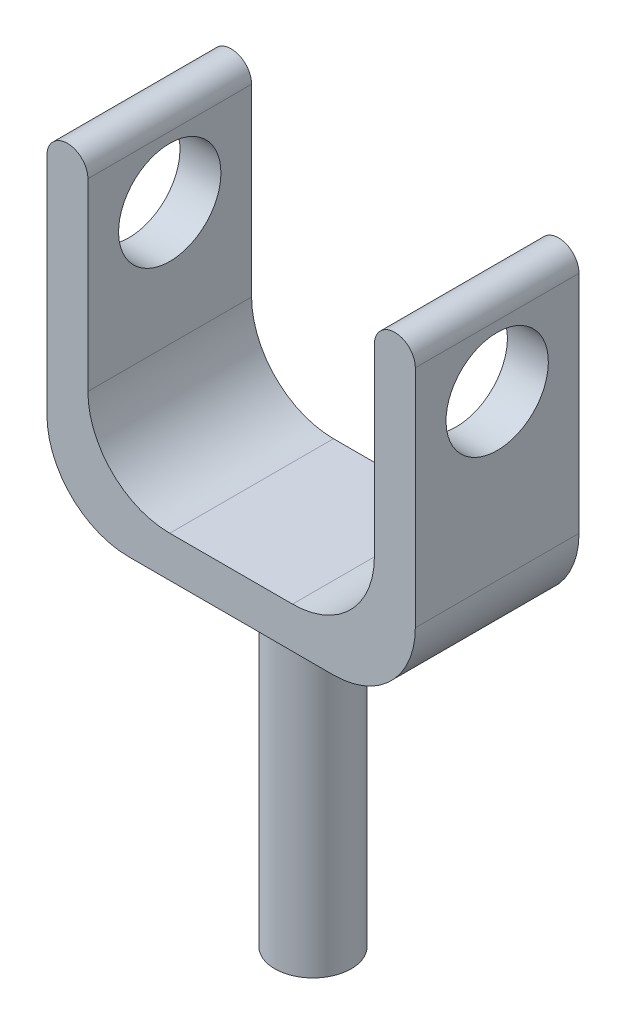
ISO-10303-21;
HEADER;
FILE_DESCRIPTION(('STEP AP214'),'2;1');
FILE_NAME('part.step','',(''),(''),'','','');
FILE_SCHEMA(('AUTOMOTIVE_DESIGN { 1 0 10303 214 1 1 1 1 }'));
ENDSEC;
DATA;
#1=APPLICATION_CONTEXT('core data for automotive mechanical design processes');
#2=APPLICATION_PROTOCOL_DEFINITION('international standard','automotive_design',2000,#1);
#3=PRODUCT_CONTEXT('',#1,'mechanical');
#4=PRODUCT('Part','Part','',(#3));
#5=PRODUCT_RELATED_PRODUCT_CATEGORY('part','',(#4));
#6=PRODUCT_DEFINITION_FORMATION('','',#4);
#7=PRODUCT_DEFINITION_CONTEXT('part definition',#1,'design');
#8=PRODUCT_DEFINITION('design','',#6,#7);
#9=PRODUCT_DEFINITION_SHAPE('','',#8);
#10=(LENGTH_UNIT() NAMED_UNIT(*) SI_UNIT(.MILLI.,.METRE.));
#11=(NAMED_UNIT(*) PLANE_ANGLE_UNIT() SI_UNIT($,.RADIAN.));
#12=(NAMED_UNIT(*) SI_UNIT($,.STERADIAN.) SOLID_ANGLE_UNIT());
#13=UNCERTAINTY_MEASURE_WITH_UNIT(LENGTH_MEASURE(1.E-05),#10,'distance_accuracy_value','');
#14=(GEOMETRIC_REPRESENTATION_CONTEXT(3) GLOBAL_UNCERTAINTY_ASSIGNED_CONTEXT((#13)) GLOBAL_UNIT_ASSIGNED_CONTEXT((#10,
#11,#12)) REPRESENTATION_CONTEXT('',''));
#15=CARTESIAN_POINT('',(0.,0.,0.));
#16=DIRECTION('',(0.,0.,1.));
#17=DIRECTION('',(1.,0.,0.));
#18=AXIS2_PLACEMENT_3D('',#15,#16,#17);
#19=CARTESIAN_POINT('',(-17.5,5.9702793047454,10.));
#20=DIRECTION('',(0.,-1.,0.));
#21=DIRECTION('',(0.,0.,-1.));
#22=AXIS2_PLACEMENT_3D('',#19,#20,#21);
#23=PLANE('',#22);
#24=DIRECTION('',(-1.,0.,0.));
#25=VECTOR('',#24,1.);
#26=CARTESIAN_POINT('',(-17.5,5.9702793047454,-10.));
#27=LINE('',#26,#25);
#28=CARTESIAN_POINT('',(7.50000000000001,5.9702793047454,-10.));
#29=VERTEX_POINT('',#28);
#30=CARTESIAN_POINT('',(-7.5,5.9702793047454,-10.));
#31=VERTEX_POINT('',#30);
#32=EDGE_CURVE('E185',#29,#31,#27,.T.);
#33=ORIENTED_EDGE('',*,*,#32,.T.);
#34=DIRECTION('',(0.,0.,-1.));
#35=VECTOR('',#34,1.);
#36=CARTESIAN_POINT('',(-7.5,5.9702793047454,10.));
#37=LINE('',#36,#35);
#38=CARTESIAN_POINT('',(-7.5,5.9702793047454,10.));
#39=VERTEX_POINT('',#38);
#40=EDGE_CURVE('E227',#31,#39,#37,.F.);
#41=ORIENTED_EDGE('',*,*,#40,.T.);
#42=DIRECTION('',(-1.,0.,0.));
#43=VECTOR('',#42,1.);
#44=CARTESIAN_POINT('',(-17.5,5.9702793047454,10.));
#45=LINE('',#44,#43);
#46=CARTESIAN_POINT('',(7.50000000000001,5.9702793047454,10.));
#47=VERTEX_POINT('',#46);
#48=EDGE_CURVE('E149',#47,#39,#45,.T.);
#49=ORIENTED_EDGE('',*,*,#48,.F.);
#50=DIRECTION('',(0.,0.,-1.));
#51=VECTOR('',#50,1.);
#52=CARTESIAN_POINT('',(7.50000000000001,5.9702793047454,-10.));
#53=LINE('',#52,#51);
#54=EDGE_CURVE('E223',#47,#29,#53,.T.);
#55=ORIENTED_EDGE('',*,*,#54,.T.);
#56=EDGE_LOOP('',(#33,#41,#49,#55));
#57=FACE_BOUND('',#56,.T.);
#58=ADVANCED_FACE('F43',(#57),#23,.F.);
#59=CARTESIAN_POINT('',(-17.5,5.9702793047454,10.));
#60=DIRECTION('',(-1.,0.,0.));
#61=DIRECTION('',(0.,0.,1.));
#62=AXIS2_PLACEMENT_3D('',#59,#60,#61);
#63=PLANE('',#62);
#64=CARTESIAN_POINT('',(-17.5,30.9702793047454,0.));
#65=DIRECTION('',(-1.,0.,0.));
#66=DIRECTION('',(0.,0.,1.));
#67=AXIS2_PLACEMENT_3D('',#64,#65,#66);
#68=CIRCLE('',#67,6.25);
#69=CARTESIAN_POINT('',(-17.5,37.2202793047454,0.));
#70=VERTEX_POINT('',#69);
#71=EDGE_CURVE('E289',#70,#70,#68,.T.);
#72=ORIENTED_EDGE('',*,*,#71,.T.);
#73=EDGE_LOOP('',(#72));
#74=FACE_BOUND('',#73,.T.);
#75=DIRECTION('',(0.,1.,0.));
#76=VECTOR('',#75,1.);
#77=CARTESIAN_POINT('',(-17.5,5.9702793047454,10.));
#78=LINE('',#77,#76);
#79=CARTESIAN_POINT('',(-17.5,15.9702793047454,10.));
#80=VERTEX_POINT('',#79);
#81=CARTESIAN_POINT('',(-17.5,38.4702793047454,10.));
#82=VERTEX_POINT('',#81);
#83=EDGE_CURVE('E136',#80,#82,#78,.T.);
#84=ORIENTED_EDGE('',*,*,#83,.F.);
#85=DIRECTION('',(0.,0.,-1.));
#86=VECTOR('',#85,1.);
#87=CARTESIAN_POINT('',(-17.5,15.9702793047454,-10.));
#88=LINE('',#87,#86);
#89=CARTESIAN_POINT('',(-17.5,15.9702793047454,-10.));
#90=VERTEX_POINT('',#89);
#91=EDGE_CURVE('E220',#80,#90,#88,.T.);
#92=ORIENTED_EDGE('',*,*,#91,.T.);
#93=DIRECTION('',(0.,1.,0.));
#94=VECTOR('',#93,1.);
#95=CARTESIAN_POINT('',(-17.5,5.9702793047454,-10.));
#96=LINE('',#95,#94);
#97=CARTESIAN_POINT('',(-17.5,38.4702793047454,-10.));
#98=VERTEX_POINT('',#97);
#99=EDGE_CURVE('E155',#90,#98,#96,.T.);
#100=ORIENTED_EDGE('',*,*,#99,.T.);
#101=DIRECTION('',(0.,0.,-1.));
#102=VECTOR('',#101,1.);
#103=CARTESIAN_POINT('',(-17.5,38.4702793047454,10.));
#104=LINE('',#103,#102);
#105=EDGE_CURVE('E152',#82,#98,#104,.T.);
#106=ORIENTED_EDGE('',*,*,#105,.F.);
#107=EDGE_LOOP('',(#84,#92,#100,#106));
#108=FACE_BOUND('',#107,.T.);
#109=ADVANCED_FACE('F153',(#74,#108),#63,.F.);
#110=CARTESIAN_POINT('',(-20.,38.4702793047454,10.));
#111=DIRECTION('',(0.,0.,-1.));
#112=DIRECTION('',(-1.,0.,0.));
#113=AXIS2_PLACEMENT_3D('',#110,#111,#112);
#114=CYLINDRICAL_SURFACE('',#113,2.5);
#115=CARTESIAN_POINT('',(-20.,38.4702793047454,-10.));
#116=DIRECTION('',(0.,0.,1.));
#117=DIRECTION('',(1.,0.,0.));
#118=AXIS2_PLACEMENT_3D('',#115,#116,#117);
#119=CIRCLE('',#118,2.5);
#120=CARTESIAN_POINT('',(-22.5,38.4702793047454,-10.));
#121=VERTEX_POINT('',#120);
#122=EDGE_CURVE('E192',#98,#121,#119,.T.);
#123=ORIENTED_EDGE('',*,*,#122,.T.);
#124=DIRECTION('',(0.,0.,-1.));
#125=VECTOR('',#124,1.);
#126=CARTESIAN_POINT('',(-22.5,38.4702793047454,10.));
#127=LINE('',#126,#125);
#128=CARTESIAN_POINT('',(-22.5,38.4702793047454,10.));
#129=VERTEX_POINT('',#128);
#130=EDGE_CURVE('E160',#129,#121,#127,.T.);
#131=ORIENTED_EDGE('',*,*,#130,.F.);
#132=CARTESIAN_POINT('',(-20.,38.4702793047454,10.));
#133=DIRECTION('',(0.,0.,1.));
#134=DIRECTION('',(1.,0.,0.));
#135=AXIS2_PLACEMENT_3D('',#132,#133,#134);
#136=CIRCLE('',#135,2.5);
#137=EDGE_CURVE('E140',#82,#129,#136,.T.);
#138=ORIENTED_EDGE('',*,*,#137,.F.);
#139=ORIENTED_EDGE('',*,*,#105,.T.);
#140=EDGE_LOOP('',(#123,#131,#138,#139));
#141=FACE_BOUND('',#140,.T.);
#142=ADVANCED_FACE('F162',(#141),#114,.T.);
#143=CARTESIAN_POINT('',(-22.5,0.970279304745398,10.));
#144=DIRECTION('',(1.,0.,0.));
#145=DIRECTION('',(0.,0.,-1.));
#146=AXIS2_PLACEMENT_3D('',#143,#144,#145);
#147=PLANE('',#146);
#148=CARTESIAN_POINT('',(-22.5,30.9702793047454,0.));
#149=DIRECTION('',(1.,0.,0.));
#150=DIRECTION('',(0.,1.,0.));
#151=AXIS2_PLACEMENT_3D('',#148,#149,#150);
#152=CIRCLE('',#151,6.25);
#153=CARTESIAN_POINT('',(-22.5,37.2202793047454,0.));
#154=VERTEX_POINT('',#153);
#155=EDGE_CURVE('E297',#154,#154,#152,.T.);
#156=ORIENTED_EDGE('',*,*,#155,.T.);
#157=EDGE_LOOP('',(#156));
#158=FACE_BOUND('',#157,.T.);
#159=DIRECTION('',(0.,-1.,0.));
#160=VECTOR('',#159,1.);
#161=CARTESIAN_POINT('',(-22.5,0.970279304745398,-10.));
#162=LINE('',#161,#160);
#163=CARTESIAN_POINT('',(-22.5,10.9702793047454,-10.));
#164=VERTEX_POINT('',#163);
#165=EDGE_CURVE('E195',#121,#164,#162,.T.);
#166=ORIENTED_EDGE('',*,*,#165,.T.);
#167=DIRECTION('',(0.,0.,-1.));
#168=VECTOR('',#167,1.);
#169=CARTESIAN_POINT('',(-22.5,10.9702793047454,10.));
#170=LINE('',#169,#168);
#171=CARTESIAN_POINT('',(-22.5,10.9702793047454,10.));
#172=VERTEX_POINT('',#171);
#173=EDGE_CURVE('E60',#164,#172,#170,.F.);
#174=ORIENTED_EDGE('',*,*,#173,.T.);
#175=DIRECTION('',(0.,-1.,0.));
#176=VECTOR('',#175,1.);
#177=CARTESIAN_POINT('',(-22.5,0.970279304745398,10.));
#178=LINE('',#177,#176);
#179=EDGE_CURVE('E165',#129,#172,#178,.T.);
#180=ORIENTED_EDGE('',*,*,#179,.F.);
#181=ORIENTED_EDGE('',*,*,#130,.T.);
#182=EDGE_LOOP('',(#166,#174,#180,#181));
#183=FACE_BOUND('',#182,.T.);
#184=ADVANCED_FACE('F332',(#158,#183),#147,.F.);
#185=CARTESIAN_POINT('',(-22.5,0.970279304745398,10.));
#186=DIRECTION('',(0.,1.,0.));
#187=DIRECTION('',(0.,0.,1.));
#188=AXIS2_PLACEMENT_3D('',#185,#186,#187);
#189=PLANE('',#188);
#190=CARTESIAN_POINT('',(0.,0.970279304745398,0.));
#191=DIRECTION('',(0.,-1.,0.));
#192=DIRECTION('',(0.,0.,-1.));
#193=AXIS2_PLACEMENT_3D('',#190,#191,#192);
#194=CIRCLE('',#193,4.67425);
#195=CARTESIAN_POINT('',(0.,0.970279304745398,-4.67425));
#196=VERTEX_POINT('',#195);
#197=EDGE_CURVE('E159',#196,#196,#194,.T.);
#198=ORIENTED_EDGE('',*,*,#197,.F.);
#199=EDGE_LOOP('',(#198));
#200=FACE_BOUND('',#199,.T.);
#201=DIRECTION('',(1.,0.,0.));
#202=VECTOR('',#201,1.);
#203=CARTESIAN_POINT('',(-22.5,0.970279304745398,-10.));
#204=LINE('',#203,#202);
#205=CARTESIAN_POINT('',(-12.5,0.970279304745398,-10.));
#206=VERTEX_POINT('',#205);
#207=CARTESIAN_POINT('',(12.5,0.970279304745398,-10.));
#208=VERTEX_POINT('',#207);
#209=EDGE_CURVE('E198',#206,#208,#204,.T.);
#210=ORIENTED_EDGE('',*,*,#209,.T.);
#211=DIRECTION('',(0.,0.,-1.));
#212=VECTOR('',#211,1.);
#213=CARTESIAN_POINT('',(12.5,0.970279304745398,10.));
#214=LINE('',#213,#212);
#215=CARTESIAN_POINT('',(12.5,0.970279304745398,10.));
#216=VERTEX_POINT('',#215);
#217=EDGE_CURVE('E68',#208,#216,#214,.F.);
#218=ORIENTED_EDGE('',*,*,#217,.T.);
#219=DIRECTION('',(1.,0.,0.));
#220=VECTOR('',#219,1.);
#221=CARTESIAN_POINT('',(-22.5,0.970279304745398,10.));
#222=LINE('',#221,#220);
#223=CARTESIAN_POINT('',(-12.5,0.970279304745398,10.));
#224=VERTEX_POINT('',#223);
#225=EDGE_CURVE('E168',#224,#216,#222,.T.);
#226=ORIENTED_EDGE('',*,*,#225,.F.);
#227=DIRECTION('',(0.,0.,-1.));
#228=VECTOR('',#227,1.);
#229=CARTESIAN_POINT('',(-12.5,0.970279304745398,10.));
#230=LINE('',#229,#228);
#231=EDGE_CURVE('E243',#224,#206,#230,.T.);
#232=ORIENTED_EDGE('',*,*,#231,.T.);
#233=EDGE_LOOP('',(#210,#218,#226,#232));
#234=FACE_BOUND('',#233,.T.);
#235=ADVANCED_FACE('F318',(#200,#234),#189,.F.);
#236=CARTESIAN_POINT('',(22.5,0.970279304745398,10.));
#237=DIRECTION('',(-1.,0.,0.));
#238=DIRECTION('',(0.,-1.,0.));
#239=AXIS2_PLACEMENT_3D('',#236,#237,#238);
#240=PLANE('',#239);
#241=CARTESIAN_POINT('',(22.5,30.9702793047454,0.));
#242=DIRECTION('',(-1.,0.,0.));
#243=DIRECTION('',(0.,-1.,0.));
#244=AXIS2_PLACEMENT_3D('',#241,#242,#243);
#245=CIRCLE('',#244,6.25);
#246=CARTESIAN_POINT('',(22.5,37.2202793047454,0.));
#247=VERTEX_POINT('',#246);
#248=EDGE_CURVE('E293',#247,#247,#245,.T.);
#249=ORIENTED_EDGE('',*,*,#248,.T.);
#250=EDGE_LOOP('',(#249));
#251=FACE_BOUND('',#250,.T.);
#252=DIRECTION('',(0.,1.,0.));
#253=VECTOR('',#252,1.);
#254=CARTESIAN_POINT('',(22.5,0.970279304745398,10.));
#255=LINE('',#254,#253);
#256=CARTESIAN_POINT('',(22.5,10.9702793047454,10.));
#257=VERTEX_POINT('',#256);
#258=CARTESIAN_POINT('',(22.5,38.4702793047454,10.));
#259=VERTEX_POINT('',#258);
#260=EDGE_CURVE('E174',#257,#259,#255,.T.);
#261=ORIENTED_EDGE('',*,*,#260,.F.);
#262=DIRECTION('',(0.,0.,-1.));
#263=VECTOR('',#262,1.);
#264=CARTESIAN_POINT('',(22.5,10.9702793047454,10.));
#265=LINE('',#264,#263);
#266=CARTESIAN_POINT('',(22.5,10.9702793047454,-10.));
#267=VERTEX_POINT('',#266);
#268=EDGE_CURVE('E233',#257,#267,#265,.T.);
#269=ORIENTED_EDGE('',*,*,#268,.T.);
#270=DIRECTION('',(0.,1.,0.));
#271=VECTOR('',#270,1.);
#272=CARTESIAN_POINT('',(22.5,0.970279304745398,-10.));
#273=LINE('',#272,#271);
#274=CARTESIAN_POINT('',(22.5,38.4702793047454,-10.));
#275=VERTEX_POINT('',#274);
#276=EDGE_CURVE('E201',#267,#275,#273,.T.);
#277=ORIENTED_EDGE('',*,*,#276,.T.);
#278=DIRECTION('',(0.,0.,-1.));
#279=VECTOR('',#278,1.);
#280=CARTESIAN_POINT('',(22.5,38.4702793047454,10.));
#281=LINE('',#280,#279);
#282=EDGE_CURVE('E214',#259,#275,#281,.T.);
#283=ORIENTED_EDGE('',*,*,#282,.F.);
#284=EDGE_LOOP('',(#261,#269,#277,#283));
#285=FACE_BOUND('',#284,.T.);
#286=ADVANCED_FACE('F314',(#251,#285),#240,.F.);
#287=CARTESIAN_POINT('',(20.,38.4702793047454,10.));
#288=DIRECTION('',(0.,0.,-1.));
#289=DIRECTION('',(-1.,0.,0.));
#290=AXIS2_PLACEMENT_3D('',#287,#288,#289);
#291=CYLINDRICAL_SURFACE('',#290,2.5);
#292=CARTESIAN_POINT('',(20.,38.4702793047454,-10.));
#293=DIRECTION('',(0.,0.,1.));
#294=DIRECTION('',(-1.,0.,0.));
#295=AXIS2_PLACEMENT_3D('',#292,#293,#294);
#296=CIRCLE('',#295,2.5);
#297=CARTESIAN_POINT('',(17.5,38.4702793047454,-10.));
#298=VERTEX_POINT('',#297);
#299=EDGE_CURVE('E204',#275,#298,#296,.T.);
#300=ORIENTED_EDGE('',*,*,#299,.T.);
#301=DIRECTION('',(0.,0.,-1.));
#302=VECTOR('',#301,1.);
#303=CARTESIAN_POINT('',(17.5,38.4702793047454,10.));
#304=LINE('',#303,#302);
#305=CARTESIAN_POINT('',(17.5,38.4702793047454,10.));
#306=VERTEX_POINT('',#305);
#307=EDGE_CURVE('E184',#306,#298,#304,.T.);
#308=ORIENTED_EDGE('',*,*,#307,.F.);
#309=CARTESIAN_POINT('',(20.,38.4702793047454,10.));
#310=DIRECTION('',(0.,0.,1.));
#311=DIRECTION('',(-1.,0.,0.));
#312=AXIS2_PLACEMENT_3D('',#309,#310,#311);
#313=CIRCLE('',#312,2.5);
#314=EDGE_CURVE('E177',#259,#306,#313,.T.);
#315=ORIENTED_EDGE('',*,*,#314,.F.);
#316=ORIENTED_EDGE('',*,*,#282,.T.);
#317=EDGE_LOOP('',(#300,#308,#315,#316));
#318=FACE_BOUND('',#317,.T.);
#319=ADVANCED_FACE('F317',(#318),#291,.T.);
#320=CARTESIAN_POINT('',(17.5,5.9702793047454,10.));
#321=DIRECTION('',(1.,0.,0.));
#322=DIRECTION('',(0.,1.,0.));
#323=AXIS2_PLACEMENT_3D('',#320,#321,#322);
#324=PLANE('',#323);
#325=CARTESIAN_POINT('',(17.5,30.9702793047454,0.));
#326=DIRECTION('',(1.,0.,0.));
#327=DIRECTION('',(0.,1.,0.));
#328=AXIS2_PLACEMENT_3D('',#325,#326,#327);
#329=CIRCLE('',#328,6.25);
#330=CARTESIAN_POINT('',(17.5,37.2202793047454,0.));
#331=VERTEX_POINT('',#330);
#332=EDGE_CURVE('E47',#331,#331,#329,.T.);
#333=ORIENTED_EDGE('',*,*,#332,.T.);
#334=EDGE_LOOP('',(#333));
#335=FACE_BOUND('',#334,.T.);
#336=DIRECTION('',(0.,-1.,0.));
#337=VECTOR('',#336,1.);
#338=CARTESIAN_POINT('',(17.5,5.9702793047454,-10.));
#339=LINE('',#338,#337);
#340=CARTESIAN_POINT('',(17.5,15.9702793047454,-10.));
#341=VERTEX_POINT('',#340);
#342=EDGE_CURVE('E207',#298,#341,#339,.T.);
#343=ORIENTED_EDGE('',*,*,#342,.T.);
#344=DIRECTION('',(0.,0.,-1.));
#345=VECTOR('',#344,1.);
#346=CARTESIAN_POINT('',(17.5,15.9702793047454,10.));
#347=LINE('',#346,#345);
#348=CARTESIAN_POINT('',(17.5,15.9702793047454,10.));
#349=VERTEX_POINT('',#348);
#350=EDGE_CURVE('E230',#341,#349,#347,.F.);
#351=ORIENTED_EDGE('',*,*,#350,.T.);
#352=DIRECTION('',(0.,-1.,0.));
#353=VECTOR('',#352,1.);
#354=CARTESIAN_POINT('',(17.5,5.9702793047454,10.));
#355=LINE('',#354,#353);
#356=EDGE_CURVE('E180',#306,#349,#355,.T.);
#357=ORIENTED_EDGE('',*,*,#356,.F.);
#358=ORIENTED_EDGE('',*,*,#307,.T.);
#359=EDGE_LOOP('',(#343,#351,#357,#358));
#360=FACE_BOUND('',#359,.T.);
#361=ADVANCED_FACE('F273',(#335,#360),#324,.F.);
#362=CARTESIAN_POINT('',(20.,38.4702793047454,10.));
#363=DIRECTION('',(0.,0.,-1.));
#364=DIRECTION('',(-1.,0.,0.));
#365=AXIS2_PLACEMENT_3D('',#362,#363,#364);
#366=PLANE('',#365);
#367=ORIENTED_EDGE('',*,*,#225,.T.);
#368=CARTESIAN_POINT('',(12.5,10.9702793047454,10.));
#369=DIRECTION('',(0.,0.,-1.));
#370=DIRECTION('',(-1.,0.,0.));
#371=AXIS2_PLACEMENT_3D('',#368,#369,#370);
#372=CIRCLE('',#371,10.);
#373=EDGE_CURVE('E252',#216,#257,#372,.F.);
#374=ORIENTED_EDGE('',*,*,#373,.T.);
#375=ORIENTED_EDGE('',*,*,#260,.T.);
#376=ORIENTED_EDGE('',*,*,#314,.T.);
#377=ORIENTED_EDGE('',*,*,#356,.T.);
#378=CARTESIAN_POINT('',(7.50000000000001,15.9702793047454,10.));
#379=DIRECTION('',(0.,0.,-1.));
#380=DIRECTION('',(-1.,0.,0.));
#381=AXIS2_PLACEMENT_3D('',#378,#379,#380);
#382=CIRCLE('',#381,10.);
#383=EDGE_CURVE('E11',#349,#47,#382,.T.);
#384=ORIENTED_EDGE('',*,*,#383,.T.);
#385=ORIENTED_EDGE('',*,*,#48,.T.);
#386=CARTESIAN_POINT('',(-7.5,15.9702793047454,10.));
#387=DIRECTION('',(0.,0.,-1.));
#388=DIRECTION('',(-1.,0.,0.));
#389=AXIS2_PLACEMENT_3D('',#386,#387,#388);
#390=CIRCLE('',#389,10.);
#391=EDGE_CURVE('E144',#39,#80,#390,.T.);
#392=ORIENTED_EDGE('',*,*,#391,.T.);
#393=ORIENTED_EDGE('',*,*,#83,.T.);
#394=ORIENTED_EDGE('',*,*,#137,.T.);
#395=ORIENTED_EDGE('',*,*,#179,.T.);
#396=CARTESIAN_POINT('',(-12.5,10.9702793047454,10.));
#397=DIRECTION('',(0.,0.,-1.));
#398=DIRECTION('',(-1.,0.,0.));
#399=AXIS2_PLACEMENT_3D('',#396,#397,#398);
#400=CIRCLE('',#399,10.);
#401=EDGE_CURVE('E249',#172,#224,#400,.F.);
#402=ORIENTED_EDGE('',*,*,#401,.T.);
#403=EDGE_LOOP('',(#367,#374,#375,#376,#377,#384,#385,#392,#393,#394,#395,#402));
#404=FACE_BOUND('',#403,.T.);
#405=ADVANCED_FACE('F138',(#404),#366,.F.);
#406=CARTESIAN_POINT('',(20.,38.4702793047454,-10.));
#407=DIRECTION('',(0.,0.,-1.));
#408=DIRECTION('',(-1.,0.,0.));
#409=AXIS2_PLACEMENT_3D('',#406,#407,#408);
#410=PLANE('',#409);
#411=ORIENTED_EDGE('',*,*,#276,.F.);
#412=CARTESIAN_POINT('',(12.5,10.9702793047454,-10.));
#413=DIRECTION('',(0.,0.,-1.));
#414=DIRECTION('',(-1.,0.,0.));
#415=AXIS2_PLACEMENT_3D('',#412,#413,#414);
#416=CIRCLE('',#415,10.);
#417=EDGE_CURVE('E240',#267,#208,#416,.T.);
#418=ORIENTED_EDGE('',*,*,#417,.T.);
#419=ORIENTED_EDGE('',*,*,#209,.F.);
#420=CARTESIAN_POINT('',(-12.5,10.9702793047454,-10.));
#421=DIRECTION('',(0.,0.,-1.));
#422=DIRECTION('',(-1.,0.,0.));
#423=AXIS2_PLACEMENT_3D('',#420,#421,#422);
#424=CIRCLE('',#423,10.);
#425=EDGE_CURVE('E237',#206,#164,#424,.T.);
#426=ORIENTED_EDGE('',*,*,#425,.T.);
#427=ORIENTED_EDGE('',*,*,#165,.F.);
#428=ORIENTED_EDGE('',*,*,#122,.F.);
#429=ORIENTED_EDGE('',*,*,#99,.F.);
#430=CARTESIAN_POINT('',(-7.5,15.9702793047454,-10.));
#431=DIRECTION('',(0.,0.,-1.));
#432=DIRECTION('',(-1.,0.,0.));
#433=AXIS2_PLACEMENT_3D('',#430,#431,#432);
#434=CIRCLE('',#433,10.);
#435=EDGE_CURVE('E257',#90,#31,#434,.F.);
#436=ORIENTED_EDGE('',*,*,#435,.T.);
#437=ORIENTED_EDGE('',*,*,#32,.F.);
#438=CARTESIAN_POINT('',(7.50000000000001,15.9702793047454,-10.));
#439=DIRECTION('',(0.,0.,-1.));
#440=DIRECTION('',(-1.,0.,0.));
#441=AXIS2_PLACEMENT_3D('',#438,#439,#440);
#442=CIRCLE('',#441,10.);
#443=EDGE_CURVE('E53',#29,#341,#442,.F.);
#444=ORIENTED_EDGE('',*,*,#443,.T.);
#445=ORIENTED_EDGE('',*,*,#342,.F.);
#446=ORIENTED_EDGE('',*,*,#299,.F.);
#447=EDGE_LOOP('',(#411,#418,#419,#426,#427,#428,#429,#436,#437,#444,#445,#446));
#448=FACE_BOUND('',#447,.T.);
#449=ADVANCED_FACE('F267',(#448),#410,.T.);
#450=CARTESIAN_POINT('',(0.,-39.0297206952546,0.));
#451=DIRECTION('',(0.,1.,0.));
#452=DIRECTION('',(0.,0.,1.));
#453=AXIS2_PLACEMENT_3D('',#450,#451,#452);
#454=CYLINDRICAL_SURFACE('',#453,4.67425);
#455=CARTESIAN_POINT('',(0.,-39.0297206952546,0.));
#456=DIRECTION('',(0.,-1.,0.));
#457=DIRECTION('',(0.,0.,-1.));
#458=AXIS2_PLACEMENT_3D('',#455,#456,#457);
#459=CIRCLE('',#458,4.67425);
#460=CARTESIAN_POINT('',(0.,-39.0297206952546,-4.67425));
#461=VERTEX_POINT('',#460);
#462=EDGE_CURVE('E189',#461,#461,#459,.T.);
#463=ORIENTED_EDGE('',*,*,#462,.F.);
#464=EDGE_LOOP('',(#463));
#465=FACE_BOUND('',#464,.T.);
#466=ORIENTED_EDGE('',*,*,#197,.T.);
#467=EDGE_LOOP('',(#466));
#468=FACE_BOUND('',#467,.T.);
#469=ADVANCED_FACE('F400',(#465,#468),#454,.T.);
#470=CARTESIAN_POINT('',(0.,-39.0297206952546,0.));
#471=DIRECTION('',(0.,-1.,0.));
#472=DIRECTION('',(0.,0.,-1.));
#473=AXIS2_PLACEMENT_3D('',#470,#471,#472);
#474=PLANE('',#473);
#475=ORIENTED_EDGE('',*,*,#462,.T.);
#476=EDGE_LOOP('',(#475));
#477=FACE_BOUND('',#476,.T.);
#478=ADVANCED_FACE('F353',(#477),#474,.T.);
#479=CARTESIAN_POINT('',(-7.5,15.9702793047454,10.));
#480=DIRECTION('',(0.,0.,1.));
#481=DIRECTION('',(1.,0.,0.));
#482=AXIS2_PLACEMENT_3D('',#479,#480,#481);
#483=CYLINDRICAL_SURFACE('',#482,10.);
#484=ORIENTED_EDGE('',*,*,#391,.F.);
#485=ORIENTED_EDGE('',*,*,#40,.F.);
#486=ORIENTED_EDGE('',*,*,#435,.F.);
#487=ORIENTED_EDGE('',*,*,#91,.F.);
#488=EDGE_LOOP('',(#484,#485,#486,#487));
#489=FACE_BOUND('',#488,.T.);
#490=ADVANCED_FACE('F350',(#489),#483,.F.);
#491=CARTESIAN_POINT('',(7.50000000000001,15.9702793047454,10.));
#492=DIRECTION('',(0.,0.,1.));
#493=DIRECTION('',(1.,0.,0.));
#494=AXIS2_PLACEMENT_3D('',#491,#492,#493);
#495=CYLINDRICAL_SURFACE('',#494,10.);
#496=ORIENTED_EDGE('',*,*,#383,.F.);
#497=ORIENTED_EDGE('',*,*,#350,.F.);
#498=ORIENTED_EDGE('',*,*,#443,.F.);
#499=ORIENTED_EDGE('',*,*,#54,.F.);
#500=EDGE_LOOP('',(#496,#497,#498,#499));
#501=FACE_BOUND('',#500,.T.);
#502=ADVANCED_FACE('F277',(#501),#495,.F.);
#503=CARTESIAN_POINT('',(12.5,10.9702793047454,10.));
#504=DIRECTION('',(0.,0.,-1.));
#505=DIRECTION('',(-1.,0.,0.));
#506=AXIS2_PLACEMENT_3D('',#503,#504,#505);
#507=CYLINDRICAL_SURFACE('',#506,10.);
#508=ORIENTED_EDGE('',*,*,#373,.F.);
#509=ORIENTED_EDGE('',*,*,#217,.F.);
#510=ORIENTED_EDGE('',*,*,#417,.F.);
#511=ORIENTED_EDGE('',*,*,#268,.F.);
#512=EDGE_LOOP('',(#508,#509,#510,#511));
#513=FACE_BOUND('',#512,.T.);
#514=ADVANCED_FACE('F326',(#513),#507,.T.);
#515=CARTESIAN_POINT('',(-12.5,10.9702793047454,10.));
#516=DIRECTION('',(0.,0.,-1.));
#517=DIRECTION('',(-1.,0.,0.));
#518=AXIS2_PLACEMENT_3D('',#515,#516,#517);
#519=CYLINDRICAL_SURFACE('',#518,10.);
#520=ORIENTED_EDGE('',*,*,#401,.F.);
#521=ORIENTED_EDGE('',*,*,#173,.F.);
#522=ORIENTED_EDGE('',*,*,#425,.F.);
#523=ORIENTED_EDGE('',*,*,#231,.F.);
#524=EDGE_LOOP('',(#520,#521,#522,#523));
#525=FACE_BOUND('',#524,.T.);
#526=ADVANCED_FACE('F45',(#525),#519,.T.);
#527=CARTESIAN_POINT('',(-22.5,30.9702793047454,0.));
#528=DIRECTION('',(1.,0.,0.));
#529=DIRECTION('',(0.,1.,0.));
#530=AXIS2_PLACEMENT_3D('',#527,#528,#529);
#531=CYLINDRICAL_SURFACE('',#530,6.25);
#532=CARTESIAN_POINT('',(17.5,37.2202793047454,0.));
#533=CARTESIAN_POINT('',(17.5520833333333,37.2202793047454,0.));
#534=CARTESIAN_POINT('',(17.6041666666667,37.2202793047454,0.));
#535=CARTESIAN_POINT('',(17.7083333333333,37.2202793047454,0.));
#536=CARTESIAN_POINT('',(17.7604166666667,37.2202793047454,0.));
#537=CARTESIAN_POINT('',(17.8645833333333,37.2202793047454,0.));
#538=CARTESIAN_POINT('',(17.9166666666667,37.2202793047454,0.));
#539=CARTESIAN_POINT('',(18.0208333333333,37.2202793047454,0.));
#540=CARTESIAN_POINT('',(18.0729166666667,37.2202793047454,0.));
#541=CARTESIAN_POINT('',(18.1770833333333,37.2202793047454,0.));
#542=CARTESIAN_POINT('',(18.2291666666667,37.2202793047454,0.));
#543=CARTESIAN_POINT('',(18.3333333333333,37.2202793047454,0.));
#544=CARTESIAN_POINT('',(18.3854166666667,37.2202793047454,0.));
#545=CARTESIAN_POINT('',(18.4895833333333,37.2202793047454,0.));
#546=CARTESIAN_POINT('',(18.5416666666667,37.2202793047454,0.));
#547=CARTESIAN_POINT('',(18.6458333333333,37.2202793047454,0.));
#548=CARTESIAN_POINT('',(18.6979166666667,37.2202793047454,0.));
#549=CARTESIAN_POINT('',(18.8020833333333,37.2202793047454,0.));
#550=CARTESIAN_POINT('',(18.8541666666667,37.2202793047454,0.));
#551=CARTESIAN_POINT('',(18.9583333333333,37.2202793047454,0.));
#552=CARTESIAN_POINT('',(19.0104166666667,37.2202793047454,0.));
#553=CARTESIAN_POINT('',(19.1145833333333,37.2202793047454,0.));
#554=CARTESIAN_POINT('',(19.1666666666667,37.2202793047454,0.));
#555=CARTESIAN_POINT('',(19.2708333333333,37.2202793047454,0.));
#556=CARTESIAN_POINT('',(19.3229166666667,37.2202793047454,0.));
#557=CARTESIAN_POINT('',(19.4270833333333,37.2202793047454,0.));
#558=CARTESIAN_POINT('',(19.4791666666667,37.2202793047454,0.));
#559=CARTESIAN_POINT('',(19.5833333333333,37.2202793047454,0.));
#560=CARTESIAN_POINT('',(19.6354166666667,37.2202793047454,0.));
#561=CARTESIAN_POINT('',(19.7395833333333,37.2202793047454,0.));
#562=CARTESIAN_POINT('',(19.7916666666667,37.2202793047454,0.));
#563=CARTESIAN_POINT('',(19.8958333333333,37.2202793047454,0.));
#564=CARTESIAN_POINT('',(19.9479166666667,37.2202793047454,0.));
#565=CARTESIAN_POINT('',(20.0520833333333,37.2202793047454,0.));
#566=CARTESIAN_POINT('',(20.1041666666667,37.2202793047454,0.));
#567=CARTESIAN_POINT('',(20.2083333333333,37.2202793047454,0.));
#568=CARTESIAN_POINT('',(20.2604166666667,37.2202793047454,0.));
#569=CARTESIAN_POINT('',(20.3645833333333,37.2202793047454,0.));
#570=CARTESIAN_POINT('',(20.4166666666667,37.2202793047454,0.));
#571=CARTESIAN_POINT('',(20.5208333333333,37.2202793047454,0.));
#572=CARTESIAN_POINT('',(20.5729166666667,37.2202793047454,0.));
#573=CARTESIAN_POINT('',(20.6770833333333,37.2202793047454,0.));
#574=CARTESIAN_POINT('',(20.7291666666667,37.2202793047454,0.));
#575=CARTESIAN_POINT('',(20.8333333333333,37.2202793047454,0.));
#576=CARTESIAN_POINT('',(20.8854166666667,37.2202793047454,0.));
#577=CARTESIAN_POINT('',(20.9895833333333,37.2202793047454,0.));
#578=CARTESIAN_POINT('',(21.0416666666667,37.2202793047454,0.));
#579=CARTESIAN_POINT('',(21.1458333333333,37.2202793047454,0.));
#580=CARTESIAN_POINT('',(21.1979166666667,37.2202793047454,0.));
#581=CARTESIAN_POINT('',(21.3020833333333,37.2202793047454,0.));
#582=CARTESIAN_POINT('',(21.3541666666667,37.2202793047454,0.));
#583=CARTESIAN_POINT('',(21.4583333333333,37.2202793047454,0.));
#584=CARTESIAN_POINT('',(21.5104166666667,37.2202793047454,0.));
#585=CARTESIAN_POINT('',(21.6145833333333,37.2202793047454,0.));
#586=CARTESIAN_POINT('',(21.6666666666667,37.2202793047454,0.));
#587=CARTESIAN_POINT('',(21.7708333333333,37.2202793047454,0.));
#588=CARTESIAN_POINT('',(21.8229166666667,37.2202793047454,0.));
#589=CARTESIAN_POINT('',(21.9270833333333,37.2202793047454,0.));
#590=CARTESIAN_POINT('',(21.9791666666667,37.2202793047454,0.));
#591=CARTESIAN_POINT('',(22.0833333333333,37.2202793047454,0.));
#592=CARTESIAN_POINT('',(22.1354166666667,37.2202793047454,0.));
#593=CARTESIAN_POINT('',(22.2395833333333,37.2202793047454,0.));
#594=CARTESIAN_POINT('',(22.2916666666667,37.2202793047454,0.));
#595=CARTESIAN_POINT('',(22.3958333333333,37.2202793047454,0.));
#596=CARTESIAN_POINT('',(22.4479166666667,37.2202793047454,0.));
#597=CARTESIAN_POINT('',(22.5,37.2202793047454,0.));
#598=B_SPLINE_CURVE_WITH_KNOTS('',3,(#532,#533,#534,#535,#536,#537,#538,#539,#540,#541,#542,
#543,#544,#545,#546,#547,#548,#549,#550,#551,#552,#553,#554,#555,#556,#557,#558,#559,#560,#561,
#562,#563,#564,#565,#566,#567,#568,#569,#570,#571,#572,#573,#574,#575,#576,#577,#578,#579,#580,
#581,#582,#583,#584,#585,#586,#587,#588,#589,#590,#591,#592,#593,#594,#595,#596,#597),
.UNSPECIFIED.,.F.,.F.,(4,2,2,2,2,2,2,2,2,2,2,2,2,2,2,2,2,2,2,2,2,2,2,2,2,2,2,2,2,2,2,2,4),(0.,
0.156249999999997,0.3125,0.468750000000004,0.625000000000001,0.781249999999997,
0.937500000000001,1.09375,1.25,1.40625,1.5625,1.71875,1.875,2.03125,2.1875,2.34375000000001,2.5,
2.65625,2.8125,2.96875000000001,3.125,3.28125,3.4375,3.59375000000001,3.75,3.90625,4.0625,
4.21875000000001,4.375,4.53125,4.6875,4.84375000000001,5.),.UNSPECIFIED.);
#599=EDGE_CURVE('BSEAM307',#331,#247,#598,.T.);
#600=ORIENTED_EDGE('',*,*,#332,.F.);
#601=ORIENTED_EDGE('',*,*,#248,.F.);
#602=ORIENTED_EDGE('',*,*,#599,.T.);
#603=ORIENTED_EDGE('',*,*,#599,.F.);
#604=EDGE_LOOP('',(#600,#602,#601,#603));
#605=FACE_BOUND('',#604,.T.);
#606=ADVANCED_FACE('F307',(#605),#531,.F.);
#607=CARTESIAN_POINT('',(-22.5,37.2202793047454,0.));
#608=CARTESIAN_POINT('',(-22.4479166666667,37.2202793047454,0.));
#609=CARTESIAN_POINT('',(-22.3958333333333,37.2202793047454,0.));
#610=CARTESIAN_POINT('',(-22.2916666666667,37.2202793047454,0.));
#611=CARTESIAN_POINT('',(-22.2395833333333,37.2202793047454,0.));
#612=CARTESIAN_POINT('',(-22.1354166666667,37.2202793047454,0.));
#613=CARTESIAN_POINT('',(-22.0833333333333,37.2202793047454,0.));
#614=CARTESIAN_POINT('',(-21.9791666666667,37.2202793047454,0.));
#615=CARTESIAN_POINT('',(-21.9270833333333,37.2202793047454,0.));
#616=CARTESIAN_POINT('',(-21.8229166666667,37.2202793047454,0.));
#617=CARTESIAN_POINT('',(-21.7708333333333,37.2202793047454,0.));
#618=CARTESIAN_POINT('',(-21.6666666666667,37.2202793047454,0.));
#619=CARTESIAN_POINT('',(-21.6145833333333,37.2202793047454,0.));
#620=CARTESIAN_POINT('',(-21.5104166666667,37.2202793047454,0.));
#621=CARTESIAN_POINT('',(-21.4583333333333,37.2202793047454,0.));
#622=CARTESIAN_POINT('',(-21.3541666666667,37.2202793047454,0.));
#623=CARTESIAN_POINT('',(-21.3020833333333,37.2202793047454,0.));
#624=CARTESIAN_POINT('',(-21.1979166666667,37.2202793047454,0.));
#625=CARTESIAN_POINT('',(-21.1458333333333,37.2202793047454,0.));
#626=CARTESIAN_POINT('',(-21.0416666666667,37.2202793047454,0.));
#627=CARTESIAN_POINT('',(-20.9895833333333,37.2202793047454,0.));
#628=CARTESIAN_POINT('',(-20.8854166666667,37.2202793047454,0.));
#629=CARTESIAN_POINT('',(-20.8333333333333,37.2202793047454,0.));
#630=CARTESIAN_POINT('',(-20.7291666666667,37.2202793047454,0.));
#631=CARTESIAN_POINT('',(-20.6770833333333,37.2202793047454,0.));
#632=CARTESIAN_POINT('',(-20.5729166666667,37.2202793047454,0.));
#633=CARTESIAN_POINT('',(-20.5208333333333,37.2202793047454,0.));
#634=CARTESIAN_POINT('',(-20.4166666666667,37.2202793047454,0.));
#635=CARTESIAN_POINT('',(-20.3645833333333,37.2202793047454,0.));
#636=CARTESIAN_POINT('',(-20.2604166666667,37.2202793047454,0.));
#637=CARTESIAN_POINT('',(-20.2083333333333,37.2202793047454,0.));
#638=CARTESIAN_POINT('',(-20.1041666666667,37.2202793047454,0.));
#639=CARTESIAN_POINT('',(-20.0520833333333,37.2202793047454,0.));
#640=CARTESIAN_POINT('',(-19.9479166666667,37.2202793047454,0.));
#641=CARTESIAN_POINT('',(-19.8958333333333,37.2202793047454,0.));
#642=CARTESIAN_POINT('',(-19.7916666666667,37.2202793047454,0.));
#643=CARTESIAN_POINT('',(-19.7395833333333,37.2202793047454,0.));
#644=CARTESIAN_POINT('',(-19.6354166666667,37.2202793047454,0.));
#645=CARTESIAN_POINT('',(-19.5833333333333,37.2202793047454,0.));
#646=CARTESIAN_POINT('',(-19.4791666666667,37.2202793047454,0.));
#647=CARTESIAN_POINT('',(-19.4270833333333,37.2202793047454,0.));
#648=CARTESIAN_POINT('',(-19.3229166666667,37.2202793047454,0.));
#649=CARTESIAN_POINT('',(-19.2708333333333,37.2202793047454,0.));
#650=CARTESIAN_POINT('',(-19.1666666666667,37.2202793047454,0.));
#651=CARTESIAN_POINT('',(-19.1145833333333,37.2202793047454,0.));
#652=CARTESIAN_POINT('',(-19.0104166666667,37.2202793047454,0.));
#653=CARTESIAN_POINT('',(-18.9583333333333,37.2202793047454,0.));
#654=CARTESIAN_POINT('',(-18.8541666666667,37.2202793047454,0.));
#655=CARTESIAN_POINT('',(-18.8020833333333,37.2202793047454,0.));
#656=CARTESIAN_POINT('',(-18.6979166666667,37.2202793047454,0.));
#657=CARTESIAN_POINT('',(-18.6458333333333,37.2202793047454,0.));
#658=CARTESIAN_POINT('',(-18.5416666666667,37.2202793047454,0.));
#659=CARTESIAN_POINT('',(-18.4895833333333,37.2202793047454,0.));
#660=CARTESIAN_POINT('',(-18.3854166666667,37.2202793047454,0.));
#661=CARTESIAN_POINT('',(-18.3333333333333,37.2202793047454,0.));
#662=CARTESIAN_POINT('',(-18.2291666666667,37.2202793047454,0.));
#663=CARTESIAN_POINT('',(-18.1770833333333,37.2202793047454,0.));
#664=CARTESIAN_POINT('',(-18.0729166666667,37.2202793047454,0.));
#665=CARTESIAN_POINT('',(-18.0208333333333,37.2202793047454,0.));
#666=CARTESIAN_POINT('',(-17.9166666666667,37.2202793047454,0.));
#667=CARTESIAN_POINT('',(-17.8645833333333,37.2202793047454,0.));
#668=CARTESIAN_POINT('',(-17.7604166666667,37.2202793047454,0.));
#669=CARTESIAN_POINT('',(-17.7083333333333,37.2202793047454,0.));
#670=CARTESIAN_POINT('',(-17.6041666666667,37.2202793047454,0.));
#671=CARTESIAN_POINT('',(-17.5520833333333,37.2202793047454,0.));
#672=CARTESIAN_POINT('',(-17.5,37.2202793047454,0.));
#673=B_SPLINE_CURVE_WITH_KNOTS('',3,(#607,#608,#609,#610,#611,#612,#613,#614,#615,#616,#617,
#618,#619,#620,#621,#622,#623,#624,#625,#626,#627,#628,#629,#630,#631,#632,#633,#634,#635,#636,
#637,#638,#639,#640,#641,#642,#643,#644,#645,#646,#647,#648,#649,#650,#651,#652,#653,#654,#655,
#656,#657,#658,#659,#660,#661,#662,#663,#664,#665,#666,#667,#668,#669,#670,#671,#672),
.UNSPECIFIED.,.F.,.F.,(4,2,2,2,2,2,2,2,2,2,2,2,2,2,2,2,2,2,2,2,2,2,2,2,2,2,2,2,2,2,2,2,4),(0.,
0.15625,0.3125,0.46875,0.625000000000001,0.781250000000001,0.937500000000001,1.09375,1.25,
1.40625,1.5625,1.71875,1.875,2.03125,2.1875,2.34375,2.5,2.65625,2.8125,2.96875,3.125,3.28125,
3.4375,3.59375,3.75,3.90625,4.0625,4.21875,4.375,4.53125,4.6875,4.84375,5.),.UNSPECIFIED.);
#674=EDGE_CURVE('BSEAM310',#154,#70,#673,.T.);
#675=ORIENTED_EDGE('',*,*,#155,.F.);
#676=ORIENTED_EDGE('',*,*,#71,.F.);
#677=ORIENTED_EDGE('',*,*,#674,.T.);
#678=ORIENTED_EDGE('',*,*,#674,.F.);
#679=EDGE_LOOP('',(#675,#677,#676,#678));
#680=FACE_BOUND('',#679,.T.);
#681=ADVANCED_FACE('F310',(#680),#531,.F.);
#682=CLOSED_SHELL('',(#58,#109,#142,#184,#235,#286,#319,#361,#405,#449,#469,#478,#490,#502,#514,
#526,#606,#681));
#683=MANIFOLD_SOLID_BREP('B2',#682);
#684=ADVANCED_BREP_SHAPE_REPRESENTATION('',(#18,#683),#14);
#685=SHAPE_DEFINITION_REPRESENTATION(#9,#684);
ENDSEC;
END-ISO-10303-21;
